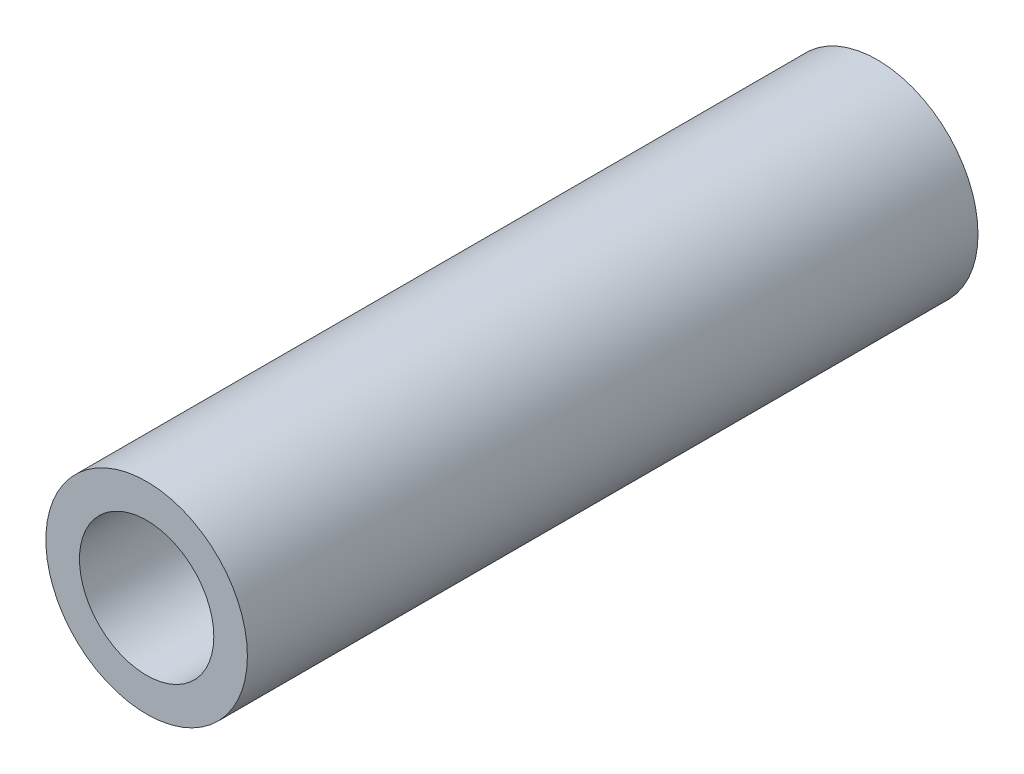
ISO-10303-21;
HEADER;
FILE_DESCRIPTION(('STEP AP214'),'2;1');
FILE_NAME('part.step','',(''),(''),'','','');
FILE_SCHEMA(('AUTOMOTIVE_DESIGN { 1 0 10303 214 1 1 1 1 }'));
ENDSEC;
DATA;
#1=APPLICATION_CONTEXT('core data for automotive mechanical design processes');
#2=APPLICATION_PROTOCOL_DEFINITION('international standard','automotive_design',2000,#1);
#3=PRODUCT_CONTEXT('',#1,'mechanical');
#4=PRODUCT('Part','Part','',(#3));
#5=PRODUCT_RELATED_PRODUCT_CATEGORY('part','',(#4));
#6=PRODUCT_DEFINITION_FORMATION('','',#4);
#7=PRODUCT_DEFINITION_CONTEXT('part definition',#1,'design');
#8=PRODUCT_DEFINITION('design','',#6,#7);
#9=PRODUCT_DEFINITION_SHAPE('','',#8);
#10=(LENGTH_UNIT() NAMED_UNIT(*) SI_UNIT(.MILLI.,.METRE.));
#11=(NAMED_UNIT(*) PLANE_ANGLE_UNIT() SI_UNIT($,.RADIAN.));
#12=(NAMED_UNIT(*) SI_UNIT($,.STERADIAN.) SOLID_ANGLE_UNIT());
#13=UNCERTAINTY_MEASURE_WITH_UNIT(LENGTH_MEASURE(1.E-05),#10,'distance_accuracy_value','');
#14=(GEOMETRIC_REPRESENTATION_CONTEXT(3) GLOBAL_UNCERTAINTY_ASSIGNED_CONTEXT((#13)) GLOBAL_UNIT_ASSIGNED_CONTEXT((#10,
#11,#12)) REPRESENTATION_CONTEXT('',''));
#15=CARTESIAN_POINT('',(0.,0.,0.));
#16=DIRECTION('',(0.,0.,1.));
#17=DIRECTION('',(1.,0.,0.));
#18=AXIS2_PLACEMENT_3D('',#15,#16,#17);
#19=CARTESIAN_POINT('',(0.,0.,10.875));
#20=DIRECTION('',(0.,0.,1.));
#21=DIRECTION('',(1.,0.,0.));
#22=AXIS2_PLACEMENT_3D('',#19,#20,#21);
#23=CYLINDRICAL_SURFACE('',#22,2.);
#24=CARTESIAN_POINT('',(0.,0.,0.));
#25=DIRECTION('',(0.,0.,1.));
#26=DIRECTION('',(1.,0.,0.));
#27=AXIS2_PLACEMENT_3D('',#24,#25,#26);
#28=CIRCLE('',#27,2.);
#29=CARTESIAN_POINT('',(2.,0.,0.));
#30=VERTEX_POINT('',#29);
#31=EDGE_CURVE('E18',#30,#30,#28,.F.);
#32=ORIENTED_EDGE('',*,*,#31,.T.);
#33=EDGE_LOOP('',(#32));
#34=FACE_BOUND('',#33,.T.);
#35=CARTESIAN_POINT('',(0.,0.,21.75));
#36=DIRECTION('',(0.,0.,1.));
#37=DIRECTION('',(1.,0.,0.));
#38=AXIS2_PLACEMENT_3D('',#35,#36,#37);
#39=CIRCLE('',#38,2.);
#40=CARTESIAN_POINT('',(2.,0.,21.75));
#41=VERTEX_POINT('',#40);
#42=EDGE_CURVE('E27',#41,#41,#39,.F.);
#43=ORIENTED_EDGE('',*,*,#42,.F.);
#44=EDGE_LOOP('',(#43));
#45=FACE_BOUND('',#44,.T.);
#46=ADVANCED_FACE('F15',(#34,#45),#23,.F.);
#47=CARTESIAN_POINT('',(0.,0.,0.));
#48=DIRECTION('',(0.,0.,1.));
#49=DIRECTION('',(1.,0.,0.));
#50=AXIS2_PLACEMENT_3D('',#47,#48,#49);
#51=PLANE('',#50);
#52=ORIENTED_EDGE('',*,*,#31,.F.);
#53=EDGE_LOOP('',(#52));
#54=FACE_BOUND('',#53,.T.);
#55=CARTESIAN_POINT('',(0.,0.,0.));
#56=DIRECTION('',(0.,0.,1.));
#57=DIRECTION('',(1.,0.,0.));
#58=AXIS2_PLACEMENT_3D('',#55,#56,#57);
#59=CIRCLE('',#58,3.);
#60=CARTESIAN_POINT('',(3.,0.,0.));
#61=VERTEX_POINT('',#60);
#62=EDGE_CURVE('E22',#61,#61,#59,.T.);
#63=ORIENTED_EDGE('',*,*,#62,.F.);
#64=EDGE_LOOP('',(#63));
#65=FACE_BOUND('',#64,.T.);
#66=ADVANCED_FACE('F37',(#54,#65),#51,.F.);
#67=CARTESIAN_POINT('',(0.,0.,21.75));
#68=DIRECTION('',(0.,0.,1.));
#69=DIRECTION('',(1.,0.,0.));
#70=AXIS2_PLACEMENT_3D('',#67,#68,#69);
#71=PLANE('',#70);
#72=ORIENTED_EDGE('',*,*,#42,.T.);
#73=EDGE_LOOP('',(#72));
#74=FACE_BOUND('',#73,.T.);
#75=CARTESIAN_POINT('',(0.,0.,21.75));
#76=DIRECTION('',(0.,0.,1.));
#77=DIRECTION('',(1.,0.,0.));
#78=AXIS2_PLACEMENT_3D('',#75,#76,#77);
#79=CIRCLE('',#78,3.);
#80=CARTESIAN_POINT('',(3.,0.,21.75));
#81=VERTEX_POINT('',#80);
#82=EDGE_CURVE('E10',#81,#81,#79,.F.);
#83=ORIENTED_EDGE('',*,*,#82,.F.);
#84=EDGE_LOOP('',(#83));
#85=FACE_BOUND('',#84,.T.);
#86=ADVANCED_FACE('F40',(#74,#85),#71,.T.);
#87=CARTESIAN_POINT('',(0.,0.,10.875));
#88=DIRECTION('',(0.,0.,1.));
#89=DIRECTION('',(1.,0.,0.));
#90=AXIS2_PLACEMENT_3D('',#87,#88,#89);
#91=CYLINDRICAL_SURFACE('',#90,3.);
#92=ORIENTED_EDGE('',*,*,#62,.T.);
#93=EDGE_LOOP('',(#92));
#94=FACE_BOUND('',#93,.T.);
#95=ORIENTED_EDGE('',*,*,#82,.T.);
#96=EDGE_LOOP('',(#95));
#97=FACE_BOUND('',#96,.T.);
#98=ADVANCED_FACE('F43',(#94,#97),#91,.T.);
#99=CLOSED_SHELL('',(#46,#66,#86,#98));
#100=MANIFOLD_SOLID_BREP('B1',#99);
#101=ADVANCED_BREP_SHAPE_REPRESENTATION('',(#18,#100),#14);
#102=SHAPE_DEFINITION_REPRESENTATION(#9,#101);
ENDSEC;
END-ISO-10303-21;
